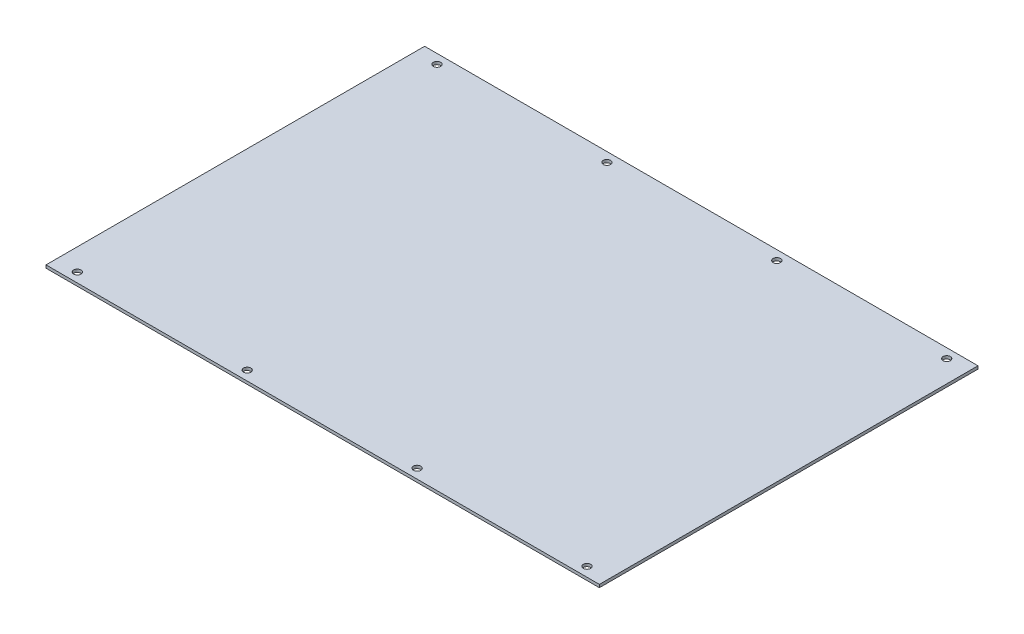
ISO-10303-21;
HEADER;
FILE_DESCRIPTION(('STEP AP214'),'2;1');
FILE_NAME('part.step','',(''),(''),'','','');
FILE_SCHEMA(('AUTOMOTIVE_DESIGN { 1 0 10303 214 1 1 1 1 }'));
ENDSEC;
DATA;
#1=APPLICATION_CONTEXT('core data for automotive mechanical design processes');
#2=APPLICATION_PROTOCOL_DEFINITION('international standard','automotive_design',2000,#1);
#3=PRODUCT_CONTEXT('',#1,'mechanical');
#4=PRODUCT('Part','Part','',(#3));
#5=PRODUCT_RELATED_PRODUCT_CATEGORY('part','',(#4));
#6=PRODUCT_DEFINITION_FORMATION('','',#4);
#7=PRODUCT_DEFINITION_CONTEXT('part definition',#1,'design');
#8=PRODUCT_DEFINITION('design','',#6,#7);
#9=PRODUCT_DEFINITION_SHAPE('','',#8);
#10=(LENGTH_UNIT() NAMED_UNIT(*) SI_UNIT(.MILLI.,.METRE.));
#11=(NAMED_UNIT(*) PLANE_ANGLE_UNIT() SI_UNIT($,.RADIAN.));
#12=(NAMED_UNIT(*) SI_UNIT($,.STERADIAN.) SOLID_ANGLE_UNIT());
#13=UNCERTAINTY_MEASURE_WITH_UNIT(LENGTH_MEASURE(1.E-05),#10,'distance_accuracy_value','');
#14=(GEOMETRIC_REPRESENTATION_CONTEXT(3) GLOBAL_UNCERTAINTY_ASSIGNED_CONTEXT((#13)) GLOBAL_UNIT_ASSIGNED_CONTEXT((#10,
#11,#12)) REPRESENTATION_CONTEXT('',''));
#15=CARTESIAN_POINT('',(0.,0.,0.));
#16=DIRECTION('',(0.,0.,1.));
#17=DIRECTION('',(1.,0.,0.));
#18=AXIS2_PLACEMENT_3D('',#15,#16,#17);
#19=CARTESIAN_POINT('',(-190.,2.,130.));
#20=DIRECTION('',(1.,0.,0.));
#21=DIRECTION('',(0.,0.,-1.));
#22=AXIS2_PLACEMENT_3D('',#19,#20,#21);
#23=PLANE('',#22);
#24=DIRECTION('',(0.,0.,1.));
#25=VECTOR('',#24,1.);
#26=CARTESIAN_POINT('',(-190.,0.,130.));
#27=LINE('',#26,#25);
#28=CARTESIAN_POINT('',(-190.,0.,-130.));
#29=VERTEX_POINT('',#28);
#30=CARTESIAN_POINT('',(-190.,0.,130.));
#31=VERTEX_POINT('',#30);
#32=EDGE_CURVE('E97',#29,#31,#27,.T.);
#33=ORIENTED_EDGE('',*,*,#32,.T.);
#34=DIRECTION('',(0.,-1.,0.));
#35=VECTOR('',#34,1.);
#36=CARTESIAN_POINT('',(-190.,2.,130.));
#37=LINE('',#36,#35);
#38=CARTESIAN_POINT('',(-190.,2.,130.));
#39=VERTEX_POINT('',#38);
#40=EDGE_CURVE('E11',#39,#31,#37,.T.);
#41=ORIENTED_EDGE('',*,*,#40,.F.);
#42=DIRECTION('',(0.,0.,1.));
#43=VECTOR('',#42,1.);
#44=CARTESIAN_POINT('',(-190.,2.,130.));
#45=LINE('',#44,#43);
#46=CARTESIAN_POINT('',(-190.,2.,-130.));
#47=VERTEX_POINT('',#46);
#48=EDGE_CURVE('E85',#47,#39,#45,.T.);
#49=ORIENTED_EDGE('',*,*,#48,.F.);
#50=DIRECTION('',(0.,-1.,0.));
#51=VECTOR('',#50,1.);
#52=CARTESIAN_POINT('',(-190.,2.,-130.));
#53=LINE('',#52,#51);
#54=EDGE_CURVE('E93',#47,#29,#53,.T.);
#55=ORIENTED_EDGE('',*,*,#54,.T.);
#56=EDGE_LOOP('',(#33,#41,#49,#55));
#57=FACE_BOUND('',#56,.T.);
#58=ADVANCED_FACE('F34',(#57),#23,.F.);
#59=CARTESIAN_POINT('',(190.,2.,130.));
#60=DIRECTION('',(0.,0.,-1.));
#61=DIRECTION('',(-1.,0.,0.));
#62=AXIS2_PLACEMENT_3D('',#59,#60,#61);
#63=PLANE('',#62);
#64=DIRECTION('',(1.,0.,0.));
#65=VECTOR('',#64,1.);
#66=CARTESIAN_POINT('',(190.,0.,130.));
#67=LINE('',#66,#65);
#68=CARTESIAN_POINT('',(190.,0.,130.));
#69=VERTEX_POINT('',#68);
#70=EDGE_CURVE('E89',#31,#69,#67,.T.);
#71=ORIENTED_EDGE('',*,*,#70,.T.);
#72=DIRECTION('',(0.,-1.,0.));
#73=VECTOR('',#72,1.);
#74=CARTESIAN_POINT('',(190.,2.,130.));
#75=LINE('',#74,#73);
#76=CARTESIAN_POINT('',(190.,2.,130.));
#77=VERTEX_POINT('',#76);
#78=EDGE_CURVE('E42',#77,#69,#75,.T.);
#79=ORIENTED_EDGE('',*,*,#78,.F.);
#80=DIRECTION('',(1.,0.,0.));
#81=VECTOR('',#80,1.);
#82=CARTESIAN_POINT('',(190.,2.,130.));
#83=LINE('',#82,#81);
#84=EDGE_CURVE('E80',#39,#77,#83,.T.);
#85=ORIENTED_EDGE('',*,*,#84,.F.);
#86=ORIENTED_EDGE('',*,*,#40,.T.);
#87=EDGE_LOOP('',(#71,#79,#85,#86));
#88=FACE_BOUND('',#87,.T.);
#89=ADVANCED_FACE('F88',(#88),#63,.F.);
#90=CARTESIAN_POINT('',(190.,2.,130.));
#91=DIRECTION('',(-1.,0.,0.));
#92=DIRECTION('',(0.,0.,1.));
#93=AXIS2_PLACEMENT_3D('',#90,#91,#92);
#94=PLANE('',#93);
#95=DIRECTION('',(0.,0.,-1.));
#96=VECTOR('',#95,1.);
#97=CARTESIAN_POINT('',(190.,0.,130.));
#98=LINE('',#97,#96);
#99=CARTESIAN_POINT('',(190.,0.,-130.));
#100=VERTEX_POINT('',#99);
#101=EDGE_CURVE('E67',#69,#100,#98,.T.);
#102=ORIENTED_EDGE('',*,*,#101,.T.);
#103=DIRECTION('',(0.,-1.,0.));
#104=VECTOR('',#103,1.);
#105=CARTESIAN_POINT('',(190.,2.,-130.));
#106=LINE('',#105,#104);
#107=CARTESIAN_POINT('',(190.,2.,-130.));
#108=VERTEX_POINT('',#107);
#109=EDGE_CURVE('E90',#108,#100,#106,.T.);
#110=ORIENTED_EDGE('',*,*,#109,.F.);
#111=DIRECTION('',(0.,0.,-1.));
#112=VECTOR('',#111,1.);
#113=CARTESIAN_POINT('',(190.,2.,130.));
#114=LINE('',#113,#112);
#115=EDGE_CURVE('E83',#77,#108,#114,.T.);
#116=ORIENTED_EDGE('',*,*,#115,.F.);
#117=ORIENTED_EDGE('',*,*,#78,.T.);
#118=EDGE_LOOP('',(#102,#110,#116,#117));
#119=FACE_BOUND('',#118,.T.);
#120=ADVANCED_FACE('F91',(#119),#94,.F.);
#121=CARTESIAN_POINT('',(190.,2.,-130.));
#122=DIRECTION('',(0.,0.,1.));
#123=DIRECTION('',(1.,0.,0.));
#124=AXIS2_PLACEMENT_3D('',#121,#122,#123);
#125=PLANE('',#124);
#126=DIRECTION('',(-1.,0.,0.));
#127=VECTOR('',#126,1.);
#128=CARTESIAN_POINT('',(190.,0.,-130.));
#129=LINE('',#128,#127);
#130=EDGE_CURVE('E73',#100,#29,#129,.T.);
#131=ORIENTED_EDGE('',*,*,#130,.T.);
#132=ORIENTED_EDGE('',*,*,#54,.F.);
#133=DIRECTION('',(-1.,0.,0.));
#134=VECTOR('',#133,1.);
#135=CARTESIAN_POINT('',(190.,2.,-130.));
#136=LINE('',#135,#134);
#137=EDGE_CURVE('E50',#108,#47,#136,.T.);
#138=ORIENTED_EDGE('',*,*,#137,.F.);
#139=ORIENTED_EDGE('',*,*,#109,.T.);
#140=EDGE_LOOP('',(#131,#132,#138,#139));
#141=FACE_BOUND('',#140,.T.);
#142=ADVANCED_FACE('F105',(#141),#125,.F.);
#143=CARTESIAN_POINT('',(0.,2.,0.));
#144=DIRECTION('',(0.,1.,0.));
#145=DIRECTION('',(0.,0.,1.));
#146=AXIS2_PLACEMENT_3D('',#143,#144,#145);
#147=PLANE('',#146);
#148=CARTESIAN_POINT('',(-175.009999999994,2.,-123.500000000003));
#149=DIRECTION('',(0.,1.,0.));
#150=DIRECTION('',(0.,0.,1.));
#151=AXIS2_PLACEMENT_3D('',#148,#149,#150);
#152=CIRCLE('',#151,2.49999999999997);
#153=CARTESIAN_POINT('',(-175.009999999994,2.,-121.000000000003));
#154=VERTEX_POINT('',#153);
#155=EDGE_CURVE('E152',#154,#154,#152,.T.);
#156=ORIENTED_EDGE('',*,*,#155,.F.);
#157=EDGE_LOOP('',(#156));
#158=FACE_BOUND('',#157,.T.);
#159=CARTESIAN_POINT('',(-58.3399999999936,2.,-123.500000000002));
#160=DIRECTION('',(0.,1.,0.));
#161=DIRECTION('',(0.,0.,1.));
#162=AXIS2_PLACEMENT_3D('',#159,#160,#161);
#163=CIRCLE('',#162,2.49999999999996);
#164=CARTESIAN_POINT('',(-58.3399999999936,2.,-121.000000000002));
#165=VERTEX_POINT('',#164);
#166=EDGE_CURVE('E146',#165,#165,#163,.T.);
#167=ORIENTED_EDGE('',*,*,#166,.F.);
#168=EDGE_LOOP('',(#167));
#169=FACE_BOUND('',#168,.T.);
#170=CARTESIAN_POINT('',(58.3300000000065,2.,-123.5));
#171=DIRECTION('',(0.,1.,0.));
#172=DIRECTION('',(0.,0.,1.));
#173=AXIS2_PLACEMENT_3D('',#170,#171,#172);
#174=CIRCLE('',#173,2.49999999999996);
#175=CARTESIAN_POINT('',(58.3300000000065,2.,-121.));
#176=VERTEX_POINT('',#175);
#177=EDGE_CURVE('E140',#176,#176,#174,.T.);
#178=ORIENTED_EDGE('',*,*,#177,.F.);
#179=EDGE_LOOP('',(#178));
#180=FACE_BOUND('',#179,.T.);
#181=CARTESIAN_POINT('',(175.000000000006,2.,-123.499999999999));
#182=DIRECTION('',(0.,1.,0.));
#183=DIRECTION('',(0.,0.,1.));
#184=AXIS2_PLACEMENT_3D('',#181,#182,#183);
#185=CIRCLE('',#184,2.49999999999996);
#186=CARTESIAN_POINT('',(175.000000000006,2.,-120.999999999999));
#187=VERTEX_POINT('',#186);
#188=EDGE_CURVE('E134',#187,#187,#185,.T.);
#189=ORIENTED_EDGE('',*,*,#188,.F.);
#190=EDGE_LOOP('',(#189));
#191=FACE_BOUND('',#190,.T.);
#192=CARTESIAN_POINT('',(175.010000000003,2.,123.500000000001));
#193=DIRECTION('',(0.,1.,0.));
#194=DIRECTION('',(0.,0.,1.));
#195=AXIS2_PLACEMENT_3D('',#192,#193,#194);
#196=CIRCLE('',#195,2.49999999999997);
#197=CARTESIAN_POINT('',(175.010000000003,2.,126.000000000001));
#198=VERTEX_POINT('',#197);
#199=EDGE_CURVE('E128',#198,#198,#196,.T.);
#200=ORIENTED_EDGE('',*,*,#199,.F.);
#201=EDGE_LOOP('',(#200));
#202=FACE_BOUND('',#201,.T.);
#203=CARTESIAN_POINT('',(58.3400000000034,2.,123.5));
#204=DIRECTION('',(0.,1.,0.));
#205=DIRECTION('',(0.,0.,1.));
#206=AXIS2_PLACEMENT_3D('',#203,#204,#205);
#207=CIRCLE('',#206,2.49999999999996);
#208=CARTESIAN_POINT('',(58.3400000000034,2.,126.));
#209=VERTEX_POINT('',#208);
#210=EDGE_CURVE('E122',#209,#209,#207,.T.);
#211=ORIENTED_EDGE('',*,*,#210,.F.);
#212=EDGE_LOOP('',(#211));
#213=FACE_BOUND('',#212,.T.);
#214=CARTESIAN_POINT('',(-58.3299999999966,2.,123.499999999998));
#215=DIRECTION('',(0.,1.,0.));
#216=DIRECTION('',(0.,0.,1.));
#217=AXIS2_PLACEMENT_3D('',#214,#215,#216);
#218=CIRCLE('',#217,2.49999999999996);
#219=CARTESIAN_POINT('',(-58.3299999999966,2.,125.999999999998));
#220=VERTEX_POINT('',#219);
#221=EDGE_CURVE('E116',#220,#220,#218,.T.);
#222=ORIENTED_EDGE('',*,*,#221,.F.);
#223=EDGE_LOOP('',(#222));
#224=FACE_BOUND('',#223,.T.);
#225=CARTESIAN_POINT('',(-174.999999999997,2.,123.499999999997));
#226=DIRECTION('',(0.,1.,0.));
#227=DIRECTION('',(0.,0.,1.));
#228=AXIS2_PLACEMENT_3D('',#225,#226,#227);
#229=CIRCLE('',#228,2.49999999999997);
#230=CARTESIAN_POINT('',(-174.999999999997,2.,125.999999999997));
#231=VERTEX_POINT('',#230);
#232=EDGE_CURVE('E100',#231,#231,#229,.T.);
#233=ORIENTED_EDGE('',*,*,#232,.F.);
#234=EDGE_LOOP('',(#233));
#235=FACE_BOUND('',#234,.T.);
#236=ORIENTED_EDGE('',*,*,#48,.T.);
#237=ORIENTED_EDGE('',*,*,#84,.T.);
#238=ORIENTED_EDGE('',*,*,#115,.T.);
#239=ORIENTED_EDGE('',*,*,#137,.T.);
#240=EDGE_LOOP('',(#236,#237,#238,#239));
#241=FACE_BOUND('',#240,.T.);
#242=ADVANCED_FACE('F81',(#158,#169,#180,#191,#202,#213,#224,#235,#241),#147,.T.);
#243=CARTESIAN_POINT('',(0.,0.,0.));
#244=DIRECTION('',(0.,1.,0.));
#245=DIRECTION('',(0.,0.,1.));
#246=AXIS2_PLACEMENT_3D('',#243,#244,#245);
#247=PLANE('',#246);
#248=CARTESIAN_POINT('',(-175.009999999994,0.,-123.500000000003));
#249=DIRECTION('',(0.,1.,0.));
#250=DIRECTION('',(0.,0.,1.));
#251=AXIS2_PLACEMENT_3D('',#248,#249,#250);
#252=CIRCLE('',#251,2.49999999999995);
#253=CARTESIAN_POINT('',(-175.009999999994,0.,-121.000000000003));
#254=VERTEX_POINT('',#253);
#255=EDGE_CURVE('E155',#254,#254,#252,.T.);
#256=ORIENTED_EDGE('',*,*,#255,.T.);
#257=EDGE_LOOP('',(#256));
#258=FACE_BOUND('',#257,.T.);
#259=CARTESIAN_POINT('',(-58.3399999999936,0.,-123.500000000002));
#260=DIRECTION('',(0.,1.,0.));
#261=DIRECTION('',(0.,0.,1.));
#262=AXIS2_PLACEMENT_3D('',#259,#260,#261);
#263=CIRCLE('',#262,2.49999999999993);
#264=CARTESIAN_POINT('',(-58.3399999999936,0.,-121.000000000002));
#265=VERTEX_POINT('',#264);
#266=EDGE_CURVE('E149',#265,#265,#263,.T.);
#267=ORIENTED_EDGE('',*,*,#266,.T.);
#268=EDGE_LOOP('',(#267));
#269=FACE_BOUND('',#268,.T.);
#270=CARTESIAN_POINT('',(58.3300000000065,0.,-123.5));
#271=DIRECTION('',(0.,1.,0.));
#272=DIRECTION('',(0.,0.,1.));
#273=AXIS2_PLACEMENT_3D('',#270,#271,#272);
#274=CIRCLE('',#273,2.49999999999994);
#275=CARTESIAN_POINT('',(58.3300000000065,0.,-121.));
#276=VERTEX_POINT('',#275);
#277=EDGE_CURVE('E143',#276,#276,#274,.T.);
#278=ORIENTED_EDGE('',*,*,#277,.T.);
#279=EDGE_LOOP('',(#278));
#280=FACE_BOUND('',#279,.T.);
#281=CARTESIAN_POINT('',(175.000000000006,0.,-123.499999999999));
#282=DIRECTION('',(0.,1.,0.));
#283=DIRECTION('',(0.,0.,1.));
#284=AXIS2_PLACEMENT_3D('',#281,#282,#283);
#285=CIRCLE('',#284,2.49999999999995);
#286=CARTESIAN_POINT('',(175.000000000006,0.,-120.999999999999));
#287=VERTEX_POINT('',#286);
#288=EDGE_CURVE('E137',#287,#287,#285,.T.);
#289=ORIENTED_EDGE('',*,*,#288,.T.);
#290=EDGE_LOOP('',(#289));
#291=FACE_BOUND('',#290,.T.);
#292=CARTESIAN_POINT('',(175.010000000003,0.,123.500000000001));
#293=DIRECTION('',(0.,1.,0.));
#294=DIRECTION('',(0.,0.,1.));
#295=AXIS2_PLACEMENT_3D('',#292,#293,#294);
#296=CIRCLE('',#295,2.49999999999995);
#297=CARTESIAN_POINT('',(175.010000000003,0.,126.000000000001));
#298=VERTEX_POINT('',#297);
#299=EDGE_CURVE('E131',#298,#298,#296,.T.);
#300=ORIENTED_EDGE('',*,*,#299,.T.);
#301=EDGE_LOOP('',(#300));
#302=FACE_BOUND('',#301,.T.);
#303=CARTESIAN_POINT('',(58.3400000000034,0.,123.5));
#304=DIRECTION('',(0.,1.,0.));
#305=DIRECTION('',(0.,0.,1.));
#306=AXIS2_PLACEMENT_3D('',#303,#304,#305);
#307=CIRCLE('',#306,2.49999999999993);
#308=CARTESIAN_POINT('',(58.3400000000034,0.,126.));
#309=VERTEX_POINT('',#308);
#310=EDGE_CURVE('E125',#309,#309,#307,.T.);
#311=ORIENTED_EDGE('',*,*,#310,.T.);
#312=EDGE_LOOP('',(#311));
#313=FACE_BOUND('',#312,.T.);
#314=CARTESIAN_POINT('',(-58.3299999999966,0.,123.499999999998));
#315=DIRECTION('',(0.,1.,0.));
#316=DIRECTION('',(0.,0.,1.));
#317=AXIS2_PLACEMENT_3D('',#314,#315,#316);
#318=CIRCLE('',#317,2.49999999999993);
#319=CARTESIAN_POINT('',(-58.3299999999966,0.,125.999999999998));
#320=VERTEX_POINT('',#319);
#321=EDGE_CURVE('E119',#320,#320,#318,.T.);
#322=ORIENTED_EDGE('',*,*,#321,.T.);
#323=EDGE_LOOP('',(#322));
#324=FACE_BOUND('',#323,.T.);
#325=CARTESIAN_POINT('',(-174.999999999997,0.,123.499999999997));
#326=DIRECTION('',(0.,1.,0.));
#327=DIRECTION('',(0.,0.,1.));
#328=AXIS2_PLACEMENT_3D('',#325,#326,#327);
#329=CIRCLE('',#328,2.49999999999995);
#330=CARTESIAN_POINT('',(-174.999999999997,0.,125.999999999997));
#331=VERTEX_POINT('',#330);
#332=EDGE_CURVE('E113',#331,#331,#329,.T.);
#333=ORIENTED_EDGE('',*,*,#332,.T.);
#334=EDGE_LOOP('',(#333));
#335=FACE_BOUND('',#334,.T.);
#336=ORIENTED_EDGE('',*,*,#32,.F.);
#337=ORIENTED_EDGE('',*,*,#130,.F.);
#338=ORIENTED_EDGE('',*,*,#101,.F.);
#339=ORIENTED_EDGE('',*,*,#70,.F.);
#340=EDGE_LOOP('',(#336,#337,#338,#339));
#341=FACE_BOUND('',#340,.T.);
#342=ADVANCED_FACE('F108',(#258,#269,#280,#291,#302,#313,#324,#335,#341),#247,.F.);
#343=CARTESIAN_POINT('',(-174.999999999997,220.,123.499999999997));
#344=DIRECTION('',(0.,1.,0.));
#345=DIRECTION('',(0.,0.,1.));
#346=AXIS2_PLACEMENT_3D('',#343,#344,#345);
#347=CYLINDRICAL_SURFACE('',#346,2.49999999999997);
#348=ORIENTED_EDGE('',*,*,#232,.T.);
#349=EDGE_LOOP('',(#348));
#350=FACE_BOUND('',#349,.T.);
#351=ORIENTED_EDGE('',*,*,#332,.F.);
#352=EDGE_LOOP('',(#351));
#353=FACE_BOUND('',#352,.T.);
#354=ADVANCED_FACE('F185',(#350,#353),#347,.F.);
#355=CARTESIAN_POINT('',(-58.3299999999966,220.,123.499999999998));
#356=DIRECTION('',(0.,1.,0.));
#357=DIRECTION('',(0.,0.,1.));
#358=AXIS2_PLACEMENT_3D('',#355,#356,#357);
#359=CYLINDRICAL_SURFACE('',#358,2.49999999999996);
#360=ORIENTED_EDGE('',*,*,#221,.T.);
#361=EDGE_LOOP('',(#360));
#362=FACE_BOUND('',#361,.T.);
#363=ORIENTED_EDGE('',*,*,#321,.F.);
#364=EDGE_LOOP('',(#363));
#365=FACE_BOUND('',#364,.T.);
#366=ADVANCED_FACE('F191',(#362,#365),#359,.F.);
#367=CARTESIAN_POINT('',(58.3400000000034,220.,123.5));
#368=DIRECTION('',(0.,1.,0.));
#369=DIRECTION('',(0.,0.,1.));
#370=AXIS2_PLACEMENT_3D('',#367,#368,#369);
#371=CYLINDRICAL_SURFACE('',#370,2.49999999999996);
#372=ORIENTED_EDGE('',*,*,#210,.T.);
#373=EDGE_LOOP('',(#372));
#374=FACE_BOUND('',#373,.T.);
#375=ORIENTED_EDGE('',*,*,#310,.F.);
#376=EDGE_LOOP('',(#375));
#377=FACE_BOUND('',#376,.T.);
#378=ADVANCED_FACE('F195',(#374,#377),#371,.F.);
#379=CARTESIAN_POINT('',(175.010000000003,220.,123.500000000001));
#380=DIRECTION('',(0.,1.,0.));
#381=DIRECTION('',(0.,0.,1.));
#382=AXIS2_PLACEMENT_3D('',#379,#380,#381);
#383=CYLINDRICAL_SURFACE('',#382,2.49999999999997);
#384=ORIENTED_EDGE('',*,*,#199,.T.);
#385=EDGE_LOOP('',(#384));
#386=FACE_BOUND('',#385,.T.);
#387=ORIENTED_EDGE('',*,*,#299,.F.);
#388=EDGE_LOOP('',(#387));
#389=FACE_BOUND('',#388,.T.);
#390=ADVANCED_FACE('F199',(#386,#389),#383,.F.);
#391=CARTESIAN_POINT('',(175.000000000006,220.,-123.499999999999));
#392=DIRECTION('',(0.,1.,0.));
#393=DIRECTION('',(0.,0.,1.));
#394=AXIS2_PLACEMENT_3D('',#391,#392,#393);
#395=CYLINDRICAL_SURFACE('',#394,2.49999999999996);
#396=ORIENTED_EDGE('',*,*,#188,.T.);
#397=EDGE_LOOP('',(#396));
#398=FACE_BOUND('',#397,.T.);
#399=ORIENTED_EDGE('',*,*,#288,.F.);
#400=EDGE_LOOP('',(#399));
#401=FACE_BOUND('',#400,.T.);
#402=ADVANCED_FACE('F203',(#398,#401),#395,.F.);
#403=CARTESIAN_POINT('',(58.3300000000065,220.,-123.5));
#404=DIRECTION('',(0.,1.,0.));
#405=DIRECTION('',(0.,0.,1.));
#406=AXIS2_PLACEMENT_3D('',#403,#404,#405);
#407=CYLINDRICAL_SURFACE('',#406,2.49999999999996);
#408=ORIENTED_EDGE('',*,*,#177,.T.);
#409=EDGE_LOOP('',(#408));
#410=FACE_BOUND('',#409,.T.);
#411=ORIENTED_EDGE('',*,*,#277,.F.);
#412=EDGE_LOOP('',(#411));
#413=FACE_BOUND('',#412,.T.);
#414=ADVANCED_FACE('F169',(#410,#413),#407,.F.);
#415=CARTESIAN_POINT('',(-58.3399999999936,220.,-123.500000000002));
#416=DIRECTION('',(0.,1.,0.));
#417=DIRECTION('',(0.,0.,1.));
#418=AXIS2_PLACEMENT_3D('',#415,#416,#417);
#419=CYLINDRICAL_SURFACE('',#418,2.49999999999996);
#420=ORIENTED_EDGE('',*,*,#166,.T.);
#421=EDGE_LOOP('',(#420));
#422=FACE_BOUND('',#421,.T.);
#423=ORIENTED_EDGE('',*,*,#266,.F.);
#424=EDGE_LOOP('',(#423));
#425=FACE_BOUND('',#424,.T.);
#426=ADVANCED_FACE('F163',(#422,#425),#419,.F.);
#427=CARTESIAN_POINT('',(-175.009999999994,220.,-123.500000000003));
#428=DIRECTION('',(0.,1.,0.));
#429=DIRECTION('',(0.,0.,1.));
#430=AXIS2_PLACEMENT_3D('',#427,#428,#429);
#431=CYLINDRICAL_SURFACE('',#430,2.49999999999997);
#432=ORIENTED_EDGE('',*,*,#155,.T.);
#433=EDGE_LOOP('',(#432));
#434=FACE_BOUND('',#433,.T.);
#435=ORIENTED_EDGE('',*,*,#255,.F.);
#436=EDGE_LOOP('',(#435));
#437=FACE_BOUND('',#436,.T.);
#438=ADVANCED_FACE('F161',(#434,#437),#431,.F.);
#439=CLOSED_SHELL('',(#58,#89,#120,#142,#242,#342,#354,#366,#378,#390,#402,#414,#426,#438));
#440=MANIFOLD_SOLID_BREP('B2',#439);
#441=ADVANCED_BREP_SHAPE_REPRESENTATION('',(#18,#440),#14);
#442=SHAPE_DEFINITION_REPRESENTATION(#9,#441);
ENDSEC;
END-ISO-10303-21;
